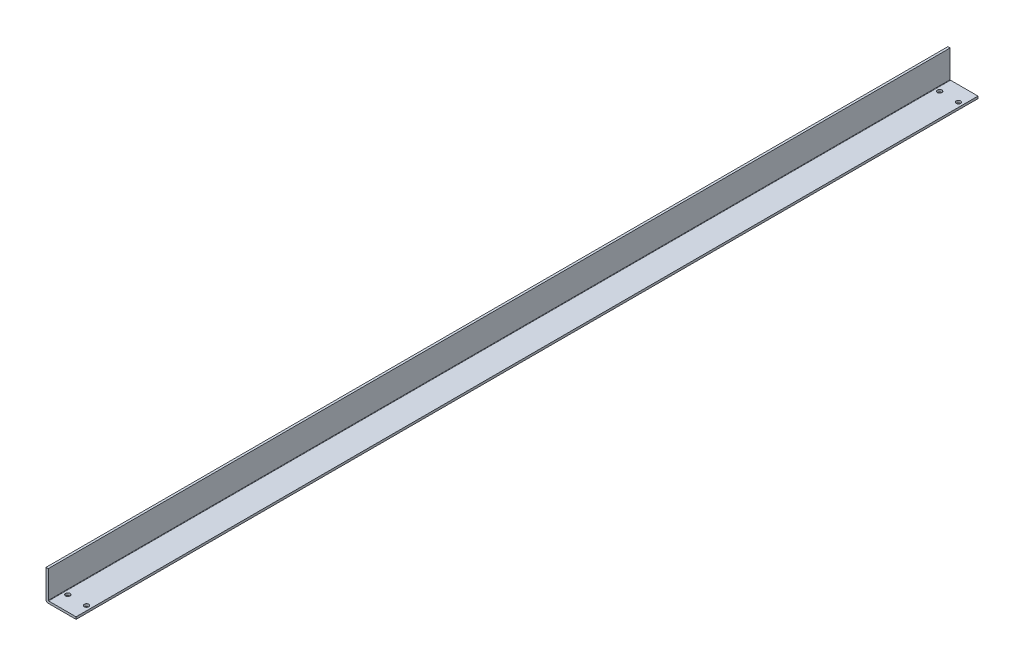
ISO-10303-21;
HEADER;
FILE_DESCRIPTION(('STEP AP214'),'2;1');
FILE_NAME('part.step','',(''),(''),'','','');
FILE_SCHEMA(('AUTOMOTIVE_DESIGN { 1 0 10303 214 1 1 1 1 }'));
ENDSEC;
DATA;
#1=APPLICATION_CONTEXT('core data for automotive mechanical design processes');
#2=APPLICATION_PROTOCOL_DEFINITION('international standard','automotive_design',2000,#1);
#3=PRODUCT_CONTEXT('',#1,'mechanical');
#4=PRODUCT('Part','Part','',(#3));
#5=PRODUCT_RELATED_PRODUCT_CATEGORY('part','',(#4));
#6=PRODUCT_DEFINITION_FORMATION('','',#4);
#7=PRODUCT_DEFINITION_CONTEXT('part definition',#1,'design');
#8=PRODUCT_DEFINITION('design','',#6,#7);
#9=PRODUCT_DEFINITION_SHAPE('','',#8);
#10=(LENGTH_UNIT() NAMED_UNIT(*) SI_UNIT(.MILLI.,.METRE.));
#11=(NAMED_UNIT(*) PLANE_ANGLE_UNIT() SI_UNIT($,.RADIAN.));
#12=(NAMED_UNIT(*) SI_UNIT($,.STERADIAN.) SOLID_ANGLE_UNIT());
#13=UNCERTAINTY_MEASURE_WITH_UNIT(LENGTH_MEASURE(1.E-05),#10,'distance_accuracy_value','');
#14=(GEOMETRIC_REPRESENTATION_CONTEXT(3) GLOBAL_UNCERTAINTY_ASSIGNED_CONTEXT((#13)) GLOBAL_UNIT_ASSIGNED_CONTEXT((#10,
#11,#12)) REPRESENTATION_CONTEXT('',''));
#15=CARTESIAN_POINT('',(0.,0.,0.));
#16=DIRECTION('',(0.,0.,1.));
#17=DIRECTION('',(1.,0.,0.));
#18=AXIS2_PLACEMENT_3D('',#15,#16,#17);
#19=CARTESIAN_POINT('',(0.,40.,1200.));
#20=DIRECTION('',(0.,-1.,0.));
#21=DIRECTION('',(0.,0.,-1.));
#22=AXIS2_PLACEMENT_3D('',#19,#20,#21);
#23=PLANE('',#22);
#24=DIRECTION('',(-1.,0.,0.));
#25=VECTOR('',#24,1.);
#26=CARTESIAN_POINT('',(0.,40.,0.));
#27=LINE('',#26,#25);
#28=CARTESIAN_POINT('',(3.,40.,0.));
#29=VERTEX_POINT('',#28);
#30=CARTESIAN_POINT('',(0.,40.,0.));
#31=VERTEX_POINT('',#30);
#32=EDGE_CURVE('E130',#29,#31,#27,.T.);
#33=ORIENTED_EDGE('',*,*,#32,.T.);
#34=DIRECTION('',(0.,0.,-1.));
#35=VECTOR('',#34,1.);
#36=CARTESIAN_POINT('',(0.,40.,1200.));
#37=LINE('',#36,#35);
#38=CARTESIAN_POINT('',(0.,40.,1200.));
#39=VERTEX_POINT('',#38);
#40=EDGE_CURVE('E11',#39,#31,#37,.T.);
#41=ORIENTED_EDGE('',*,*,#40,.F.);
#42=DIRECTION('',(-1.,0.,0.));
#43=VECTOR('',#42,1.);
#44=CARTESIAN_POINT('',(0.,40.,1200.));
#45=LINE('',#44,#43);
#46=CARTESIAN_POINT('',(3.,40.,1200.));
#47=VERTEX_POINT('',#46);
#48=EDGE_CURVE('E145',#47,#39,#45,.T.);
#49=ORIENTED_EDGE('',*,*,#48,.F.);
#50=DIRECTION('',(0.,0.,-1.));
#51=VECTOR('',#50,1.);
#52=CARTESIAN_POINT('',(3.,40.,1200.));
#53=LINE('',#52,#51);
#54=EDGE_CURVE('E126',#47,#29,#53,.T.);
#55=ORIENTED_EDGE('',*,*,#54,.T.);
#56=EDGE_LOOP('',(#33,#41,#49,#55));
#57=FACE_BOUND('',#56,.T.);
#58=ADVANCED_FACE('F34',(#57),#23,.F.);
#59=CARTESIAN_POINT('',(0.,3.00000000000002,1200.));
#60=DIRECTION('',(1.,0.,0.));
#61=DIRECTION('',(0.,0.,-1.));
#62=AXIS2_PLACEMENT_3D('',#59,#60,#61);
#63=PLANE('',#62);
#64=DIRECTION('',(0.,-1.,0.));
#65=VECTOR('',#64,1.);
#66=CARTESIAN_POINT('',(0.,3.00000000000002,0.));
#67=LINE('',#66,#65);
#68=CARTESIAN_POINT('',(0.,3.00000000000002,0.));
#69=VERTEX_POINT('',#68);
#70=EDGE_CURVE('E133',#31,#69,#67,.T.);
#71=ORIENTED_EDGE('',*,*,#70,.T.);
#72=DIRECTION('',(0.,0.,-1.));
#73=VECTOR('',#72,1.);
#74=CARTESIAN_POINT('',(0.,3.00000000000002,1200.));
#75=LINE('',#74,#73);
#76=CARTESIAN_POINT('',(0.,3.00000000000002,1200.));
#77=VERTEX_POINT('',#76);
#78=EDGE_CURVE('E42',#77,#69,#75,.T.);
#79=ORIENTED_EDGE('',*,*,#78,.F.);
#80=DIRECTION('',(0.,-1.,0.));
#81=VECTOR('',#80,1.);
#82=CARTESIAN_POINT('',(0.,3.00000000000002,1200.));
#83=LINE('',#82,#81);
#84=EDGE_CURVE('E93',#39,#77,#83,.T.);
#85=ORIENTED_EDGE('',*,*,#84,.F.);
#86=ORIENTED_EDGE('',*,*,#40,.T.);
#87=EDGE_LOOP('',(#71,#79,#85,#86));
#88=FACE_BOUND('',#87,.T.);
#89=ADVANCED_FACE('F229',(#88),#63,.F.);
#90=CARTESIAN_POINT('',(3.,3.,1200.));
#91=DIRECTION('',(0.,0.,-1.));
#92=DIRECTION('',(-1.,0.,0.));
#93=AXIS2_PLACEMENT_3D('',#90,#91,#92);
#94=CYLINDRICAL_SURFACE('',#93,3.);
#95=CARTESIAN_POINT('',(3.,3.,0.));
#96=DIRECTION('',(0.,0.,1.));
#97=DIRECTION('',(1.,0.,0.));
#98=AXIS2_PLACEMENT_3D('',#95,#96,#97);
#99=CIRCLE('',#98,3.);
#100=CARTESIAN_POINT('',(3.00000000000002,0.,0.));
#101=VERTEX_POINT('',#100);
#102=EDGE_CURVE('E136',#69,#101,#99,.T.);
#103=ORIENTED_EDGE('',*,*,#102,.T.);
#104=DIRECTION('',(0.,0.,-1.));
#105=VECTOR('',#104,1.);
#106=CARTESIAN_POINT('',(3.00000000000002,0.,1200.));
#107=LINE('',#106,#105);
#108=CARTESIAN_POINT('',(3.00000000000002,0.,1200.));
#109=VERTEX_POINT('',#108);
#110=EDGE_CURVE('E152',#109,#101,#107,.T.);
#111=ORIENTED_EDGE('',*,*,#110,.F.);
#112=CARTESIAN_POINT('',(3.,3.,1200.));
#113=DIRECTION('',(0.,0.,1.));
#114=DIRECTION('',(1.,0.,0.));
#115=AXIS2_PLACEMENT_3D('',#112,#113,#114);
#116=CIRCLE('',#115,3.);
#117=EDGE_CURVE('E160',#77,#109,#116,.T.);
#118=ORIENTED_EDGE('',*,*,#117,.F.);
#119=ORIENTED_EDGE('',*,*,#78,.T.);
#120=EDGE_LOOP('',(#103,#111,#118,#119));
#121=FACE_BOUND('',#120,.T.);
#122=ADVANCED_FACE('F158',(#121),#94,.T.);
#123=CARTESIAN_POINT('',(40.,0.,1200.));
#124=DIRECTION('',(0.,1.,0.));
#125=DIRECTION('',(0.,0.,1.));
#126=AXIS2_PLACEMENT_3D('',#123,#124,#125);
#127=PLANE('',#126);
#128=CARTESIAN_POINT('',(34.,0.,1180.));
#129=DIRECTION('',(0.,1.,0.));
#130=DIRECTION('',(0.,0.,1.));
#131=AXIS2_PLACEMENT_3D('',#128,#129,#130);
#132=CIRCLE('',#131,3.);
#133=CARTESIAN_POINT('',(34.,0.,1183.));
#134=VERTEX_POINT('',#133);
#135=EDGE_CURVE('E183',#134,#134,#132,.F.);
#136=ORIENTED_EDGE('',*,*,#135,.F.);
#137=EDGE_LOOP('',(#136));
#138=FACE_BOUND('',#137,.T.);
#139=CARTESIAN_POINT('',(9.,0.,20.));
#140=DIRECTION('',(0.,1.,0.));
#141=DIRECTION('',(0.,0.,1.));
#142=AXIS2_PLACEMENT_3D('',#139,#140,#141);
#143=CIRCLE('',#142,3.);
#144=CARTESIAN_POINT('',(9.,0.,23.));
#145=VERTEX_POINT('',#144);
#146=EDGE_CURVE('E191',#145,#145,#143,.F.);
#147=ORIENTED_EDGE('',*,*,#146,.F.);
#148=EDGE_LOOP('',(#147));
#149=FACE_BOUND('',#148,.T.);
#150=CARTESIAN_POINT('',(34.,0.,20.));
#151=DIRECTION('',(0.,1.,0.));
#152=DIRECTION('',(0.,0.,1.));
#153=AXIS2_PLACEMENT_3D('',#150,#151,#152);
#154=CIRCLE('',#153,3.);
#155=CARTESIAN_POINT('',(34.,0.,23.));
#156=VERTEX_POINT('',#155);
#157=EDGE_CURVE('E184',#156,#156,#154,.F.);
#158=ORIENTED_EDGE('',*,*,#157,.F.);
#159=EDGE_LOOP('',(#158));
#160=FACE_BOUND('',#159,.T.);
#161=CARTESIAN_POINT('',(9.,0.,1180.));
#162=DIRECTION('',(0.,1.,0.));
#163=DIRECTION('',(0.,0.,1.));
#164=AXIS2_PLACEMENT_3D('',#161,#162,#163);
#165=CIRCLE('',#164,3.);
#166=CARTESIAN_POINT('',(9.,0.,1183.));
#167=VERTEX_POINT('',#166);
#168=EDGE_CURVE('E134',#167,#167,#165,.F.);
#169=ORIENTED_EDGE('',*,*,#168,.F.);
#170=EDGE_LOOP('',(#169));
#171=FACE_BOUND('',#170,.T.);
#172=DIRECTION('',(1.,0.,0.));
#173=VECTOR('',#172,1.);
#174=CARTESIAN_POINT('',(40.,0.,0.));
#175=LINE('',#174,#173);
#176=CARTESIAN_POINT('',(40.,0.,0.));
#177=VERTEX_POINT('',#176);
#178=EDGE_CURVE('E138',#101,#177,#175,.T.);
#179=ORIENTED_EDGE('',*,*,#178,.T.);
#180=DIRECTION('',(0.,0.,-1.));
#181=VECTOR('',#180,1.);
#182=CARTESIAN_POINT('',(40.,0.,1200.));
#183=LINE('',#182,#181);
#184=CARTESIAN_POINT('',(40.,0.,1200.));
#185=VERTEX_POINT('',#184);
#186=EDGE_CURVE('E149',#185,#177,#183,.T.);
#187=ORIENTED_EDGE('',*,*,#186,.F.);
#188=DIRECTION('',(1.,0.,0.));
#189=VECTOR('',#188,1.);
#190=CARTESIAN_POINT('',(40.,0.,1200.));
#191=LINE('',#190,#189);
#192=EDGE_CURVE('E172',#109,#185,#191,.T.);
#193=ORIENTED_EDGE('',*,*,#192,.F.);
#194=ORIENTED_EDGE('',*,*,#110,.T.);
#195=EDGE_LOOP('',(#179,#187,#193,#194));
#196=FACE_BOUND('',#195,.T.);
#197=ADVANCED_FACE('F168',(#138,#149,#160,#171,#196),#127,.F.);
#198=CARTESIAN_POINT('',(40.,3.,1200.));
#199=DIRECTION('',(-1.,0.,0.));
#200=DIRECTION('',(0.,0.,1.));
#201=AXIS2_PLACEMENT_3D('',#198,#199,#200);
#202=PLANE('',#201);
#203=DIRECTION('',(0.,1.,0.));
#204=VECTOR('',#203,1.);
#205=CARTESIAN_POINT('',(40.,3.,0.));
#206=LINE('',#205,#204);
#207=CARTESIAN_POINT('',(40.,3.,0.));
#208=VERTEX_POINT('',#207);
#209=EDGE_CURVE('E140',#177,#208,#206,.T.);
#210=ORIENTED_EDGE('',*,*,#209,.T.);
#211=DIRECTION('',(0.,0.,-1.));
#212=VECTOR('',#211,1.);
#213=CARTESIAN_POINT('',(40.,3.,1200.));
#214=LINE('',#213,#212);
#215=CARTESIAN_POINT('',(40.,3.,1200.));
#216=VERTEX_POINT('',#215);
#217=EDGE_CURVE('E121',#216,#208,#214,.T.);
#218=ORIENTED_EDGE('',*,*,#217,.F.);
#219=DIRECTION('',(0.,1.,0.));
#220=VECTOR('',#219,1.);
#221=CARTESIAN_POINT('',(40.,3.,1200.));
#222=LINE('',#221,#220);
#223=EDGE_CURVE('E112',#185,#216,#222,.T.);
#224=ORIENTED_EDGE('',*,*,#223,.F.);
#225=ORIENTED_EDGE('',*,*,#186,.T.);
#226=EDGE_LOOP('',(#210,#218,#224,#225));
#227=FACE_BOUND('',#226,.T.);
#228=ADVANCED_FACE('F171',(#227),#202,.F.);
#229=CARTESIAN_POINT('',(3.50000000000001,3.,1200.));
#230=DIRECTION('',(0.,-1.,0.));
#231=DIRECTION('',(0.,0.,-1.));
#232=AXIS2_PLACEMENT_3D('',#229,#230,#231);
#233=PLANE('',#232);
#234=CARTESIAN_POINT('',(34.,3.,1180.));
#235=DIRECTION('',(0.,1.,0.));
#236=DIRECTION('',(0.,0.,1.));
#237=AXIS2_PLACEMENT_3D('',#234,#235,#236);
#238=CIRCLE('',#237,3.);
#239=CARTESIAN_POINT('',(34.,3.,1183.));
#240=VERTEX_POINT('',#239);
#241=EDGE_CURVE('E194',#240,#240,#238,.T.);
#242=ORIENTED_EDGE('',*,*,#241,.F.);
#243=EDGE_LOOP('',(#242));
#244=FACE_BOUND('',#243,.T.);
#245=CARTESIAN_POINT('',(9.,3.,20.));
#246=DIRECTION('',(0.,1.,0.));
#247=DIRECTION('',(0.,0.,1.));
#248=AXIS2_PLACEMENT_3D('',#245,#246,#247);
#249=CIRCLE('',#248,3.);
#250=CARTESIAN_POINT('',(9.,3.,23.));
#251=VERTEX_POINT('',#250);
#252=EDGE_CURVE('E187',#251,#251,#249,.T.);
#253=ORIENTED_EDGE('',*,*,#252,.F.);
#254=EDGE_LOOP('',(#253));
#255=FACE_BOUND('',#254,.T.);
#256=CARTESIAN_POINT('',(34.,3.,20.));
#257=DIRECTION('',(0.,1.,0.));
#258=DIRECTION('',(0.,0.,1.));
#259=AXIS2_PLACEMENT_3D('',#256,#257,#258);
#260=CIRCLE('',#259,3.);
#261=CARTESIAN_POINT('',(34.,3.,23.));
#262=VERTEX_POINT('',#261);
#263=EDGE_CURVE('E188',#262,#262,#260,.T.);
#264=ORIENTED_EDGE('',*,*,#263,.F.);
#265=EDGE_LOOP('',(#264));
#266=FACE_BOUND('',#265,.T.);
#267=CARTESIAN_POINT('',(9.,3.,1180.));
#268=DIRECTION('',(0.,1.,0.));
#269=DIRECTION('',(0.,0.,1.));
#270=AXIS2_PLACEMENT_3D('',#267,#268,#269);
#271=CIRCLE('',#270,3.);
#272=CARTESIAN_POINT('',(9.,3.,1183.));
#273=VERTEX_POINT('',#272);
#274=EDGE_CURVE('E180',#273,#273,#271,.T.);
#275=ORIENTED_EDGE('',*,*,#274,.F.);
#276=EDGE_LOOP('',(#275));
#277=FACE_BOUND('',#276,.T.);
#278=DIRECTION('',(-1.,0.,0.));
#279=VECTOR('',#278,1.);
#280=CARTESIAN_POINT('',(3.50000000000001,3.,0.));
#281=LINE('',#280,#279);
#282=CARTESIAN_POINT('',(3.50000000000001,3.,0.));
#283=VERTEX_POINT('',#282);
#284=EDGE_CURVE('E120',#208,#283,#281,.T.);
#285=ORIENTED_EDGE('',*,*,#284,.T.);
#286=DIRECTION('',(0.,0.,-1.));
#287=VECTOR('',#286,1.);
#288=CARTESIAN_POINT('',(3.50000000000001,3.,1200.));
#289=LINE('',#288,#287);
#290=CARTESIAN_POINT('',(3.50000000000001,3.,1200.));
#291=VERTEX_POINT('',#290);
#292=EDGE_CURVE('E117',#291,#283,#289,.T.);
#293=ORIENTED_EDGE('',*,*,#292,.F.);
#294=DIRECTION('',(-1.,0.,0.));
#295=VECTOR('',#294,1.);
#296=CARTESIAN_POINT('',(3.50000000000001,3.,1200.));
#297=LINE('',#296,#295);
#298=EDGE_CURVE('E106',#216,#291,#297,.T.);
#299=ORIENTED_EDGE('',*,*,#298,.F.);
#300=ORIENTED_EDGE('',*,*,#217,.T.);
#301=EDGE_LOOP('',(#285,#293,#299,#300));
#302=FACE_BOUND('',#301,.T.);
#303=ADVANCED_FACE('F118',(#244,#255,#266,#277,#302),#233,.F.);
#304=CARTESIAN_POINT('',(3.5,3.5,1200.));
#305=DIRECTION('',(0.,0.,-1.));
#306=DIRECTION('',(-1.,0.,0.));
#307=AXIS2_PLACEMENT_3D('',#304,#305,#306);
#308=CYLINDRICAL_SURFACE('',#307,0.5);
#309=CARTESIAN_POINT('',(3.5,3.5,0.));
#310=DIRECTION('',(0.,0.,-1.));
#311=DIRECTION('',(1.,0.,0.));
#312=AXIS2_PLACEMENT_3D('',#309,#310,#311);
#313=CIRCLE('',#312,0.5);
#314=CARTESIAN_POINT('',(3.,3.5,0.));
#315=VERTEX_POINT('',#314);
#316=EDGE_CURVE('E79',#283,#315,#313,.T.);
#317=ORIENTED_EDGE('',*,*,#316,.T.);
#318=DIRECTION('',(0.,0.,-1.));
#319=VECTOR('',#318,1.);
#320=CARTESIAN_POINT('',(3.,3.5,1200.));
#321=LINE('',#320,#319);
#322=CARTESIAN_POINT('',(3.,3.5,1200.));
#323=VERTEX_POINT('',#322);
#324=EDGE_CURVE('E122',#323,#315,#321,.T.);
#325=ORIENTED_EDGE('',*,*,#324,.F.);
#326=CARTESIAN_POINT('',(3.5,3.5,1200.));
#327=DIRECTION('',(0.,0.,-1.));
#328=DIRECTION('',(1.,0.,0.));
#329=AXIS2_PLACEMENT_3D('',#326,#327,#328);
#330=CIRCLE('',#329,0.5);
#331=EDGE_CURVE('E110',#291,#323,#330,.T.);
#332=ORIENTED_EDGE('',*,*,#331,.F.);
#333=ORIENTED_EDGE('',*,*,#292,.T.);
#334=EDGE_LOOP('',(#317,#325,#332,#333));
#335=FACE_BOUND('',#334,.T.);
#336=ADVANCED_FACE('F124',(#335),#308,.F.);
#337=CARTESIAN_POINT('',(3.,40.,1200.));
#338=DIRECTION('',(-1.,0.,0.));
#339=DIRECTION('',(0.,-1.,0.));
#340=AXIS2_PLACEMENT_3D('',#337,#338,#339);
#341=PLANE('',#340);
#342=DIRECTION('',(0.,1.,0.));
#343=VECTOR('',#342,1.);
#344=CARTESIAN_POINT('',(3.,40.,0.));
#345=LINE('',#344,#343);
#346=EDGE_CURVE('E85',#315,#29,#345,.T.);
#347=ORIENTED_EDGE('',*,*,#346,.T.);
#348=ORIENTED_EDGE('',*,*,#54,.F.);
#349=DIRECTION('',(0.,1.,0.));
#350=VECTOR('',#349,1.);
#351=CARTESIAN_POINT('',(3.,40.,1200.));
#352=LINE('',#351,#350);
#353=EDGE_CURVE('E50',#323,#47,#352,.T.);
#354=ORIENTED_EDGE('',*,*,#353,.F.);
#355=ORIENTED_EDGE('',*,*,#324,.T.);
#356=EDGE_LOOP('',(#347,#348,#354,#355));
#357=FACE_BOUND('',#356,.T.);
#358=ADVANCED_FACE('F240',(#357),#341,.F.);
#359=CARTESIAN_POINT('',(3.5,3.5,1200.));
#360=DIRECTION('',(0.,0.,1.));
#361=DIRECTION('',(1.,0.,0.));
#362=AXIS2_PLACEMENT_3D('',#359,#360,#361);
#363=PLANE('',#362);
#364=ORIENTED_EDGE('',*,*,#48,.T.);
#365=ORIENTED_EDGE('',*,*,#84,.T.);
#366=ORIENTED_EDGE('',*,*,#117,.T.);
#367=ORIENTED_EDGE('',*,*,#192,.T.);
#368=ORIENTED_EDGE('',*,*,#223,.T.);
#369=ORIENTED_EDGE('',*,*,#298,.T.);
#370=ORIENTED_EDGE('',*,*,#331,.T.);
#371=ORIENTED_EDGE('',*,*,#353,.T.);
#372=EDGE_LOOP('',(#364,#365,#366,#367,#368,#369,#370,#371));
#373=FACE_BOUND('',#372,.T.);
#374=ADVANCED_FACE('F108',(#373),#363,.T.);
#375=CARTESIAN_POINT('',(3.5,3.5,0.));
#376=DIRECTION('',(0.,0.,1.));
#377=DIRECTION('',(1.,0.,0.));
#378=AXIS2_PLACEMENT_3D('',#375,#376,#377);
#379=PLANE('',#378);
#380=ORIENTED_EDGE('',*,*,#32,.F.);
#381=ORIENTED_EDGE('',*,*,#346,.F.);
#382=ORIENTED_EDGE('',*,*,#316,.F.);
#383=ORIENTED_EDGE('',*,*,#284,.F.);
#384=ORIENTED_EDGE('',*,*,#209,.F.);
#385=ORIENTED_EDGE('',*,*,#178,.F.);
#386=ORIENTED_EDGE('',*,*,#102,.F.);
#387=ORIENTED_EDGE('',*,*,#70,.F.);
#388=EDGE_LOOP('',(#380,#381,#382,#383,#384,#385,#386,#387));
#389=FACE_BOUND('',#388,.T.);
#390=ADVANCED_FACE('F164',(#389),#379,.F.);
#391=CARTESIAN_POINT('',(9.,-0.00100000000000013,1180.));
#392=DIRECTION('',(0.,1.,0.));
#393=DIRECTION('',(0.,0.,1.));
#394=AXIS2_PLACEMENT_3D('',#391,#392,#393);
#395=CYLINDRICAL_SURFACE('',#394,3.);
#396=CARTESIAN_POINT('',(9.,3.,1183.));
#397=CARTESIAN_POINT('',(9.,2.96875,1183.));
#398=CARTESIAN_POINT('',(9.,2.9375,1183.));
#399=CARTESIAN_POINT('',(9.,2.875,1183.));
#400=CARTESIAN_POINT('',(9.,2.84375,1183.));
#401=CARTESIAN_POINT('',(9.,2.78125,1183.));
#402=CARTESIAN_POINT('',(9.,2.75,1183.));
#403=CARTESIAN_POINT('',(9.,2.6875,1183.));
#404=CARTESIAN_POINT('',(9.,2.65625,1183.));
#405=CARTESIAN_POINT('',(9.,2.59375,1183.));
#406=CARTESIAN_POINT('',(9.,2.5625,1183.));
#407=CARTESIAN_POINT('',(9.,2.5,1183.));
#408=CARTESIAN_POINT('',(9.,2.46875,1183.));
#409=CARTESIAN_POINT('',(9.,2.40625,1183.));
#410=CARTESIAN_POINT('',(9.,2.375,1183.));
#411=CARTESIAN_POINT('',(9.,2.3125,1183.));
#412=CARTESIAN_POINT('',(9.,2.28125,1183.));
#413=CARTESIAN_POINT('',(9.,2.21875,1183.));
#414=CARTESIAN_POINT('',(9.,2.1875,1183.));
#415=CARTESIAN_POINT('',(9.,2.125,1183.));
#416=CARTESIAN_POINT('',(9.,2.09375,1183.));
#417=CARTESIAN_POINT('',(9.,2.03125,1183.));
#418=CARTESIAN_POINT('',(9.,2.,1183.));
#419=CARTESIAN_POINT('',(9.,1.9375,1183.));
#420=CARTESIAN_POINT('',(9.,1.90625,1183.));
#421=CARTESIAN_POINT('',(9.,1.84375,1183.));
#422=CARTESIAN_POINT('',(9.,1.8125,1183.));
#423=CARTESIAN_POINT('',(9.,1.75,1183.));
#424=CARTESIAN_POINT('',(9.,1.71875,1183.));
#425=CARTESIAN_POINT('',(9.,1.65625,1183.));
#426=CARTESIAN_POINT('',(9.,1.625,1183.));
#427=CARTESIAN_POINT('',(9.,1.5625,1183.));
#428=CARTESIAN_POINT('',(9.,1.53125,1183.));
#429=CARTESIAN_POINT('',(9.,1.46875,1183.));
#430=CARTESIAN_POINT('',(9.,1.4375,1183.));
#431=CARTESIAN_POINT('',(9.,1.375,1183.));
#432=CARTESIAN_POINT('',(9.,1.34375,1183.));
#433=CARTESIAN_POINT('',(9.,1.28125,1183.));
#434=CARTESIAN_POINT('',(9.,1.25,1183.));
#435=CARTESIAN_POINT('',(9.,1.1875,1183.));
#436=CARTESIAN_POINT('',(9.,1.15625,1183.));
#437=CARTESIAN_POINT('',(9.,1.09375,1183.));
#438=CARTESIAN_POINT('',(9.,1.0625,1183.));
#439=CARTESIAN_POINT('',(9.,1.,1183.));
#440=CARTESIAN_POINT('',(9.,0.96875,1183.));
#441=CARTESIAN_POINT('',(9.,0.90625,1183.));
#442=CARTESIAN_POINT('',(9.,0.875,1183.));
#443=CARTESIAN_POINT('',(9.,0.8125,1183.));
#444=CARTESIAN_POINT('',(9.,0.78125,1183.));
#445=CARTESIAN_POINT('',(9.,0.71875,1183.));
#446=CARTESIAN_POINT('',(9.,0.6875,1183.));
#447=CARTESIAN_POINT('',(9.,0.625,1183.));
#448=CARTESIAN_POINT('',(9.,0.59375,1183.));
#449=CARTESIAN_POINT('',(9.,0.53125,1183.));
#450=CARTESIAN_POINT('',(9.,0.5,1183.));
#451=CARTESIAN_POINT('',(9.,0.4375,1183.));
#452=CARTESIAN_POINT('',(9.,0.40625,1183.));
#453=CARTESIAN_POINT('',(9.,0.34375,1183.));
#454=CARTESIAN_POINT('',(9.,0.3125,1183.));
#455=CARTESIAN_POINT('',(9.,0.25,1183.));
#456=CARTESIAN_POINT('',(9.,0.21875,1183.));
#457=CARTESIAN_POINT('',(9.,0.15625,1183.));
#458=CARTESIAN_POINT('',(9.,0.125,1183.));
#459=CARTESIAN_POINT('',(9.,0.0625000000000001,1183.));
#460=CARTESIAN_POINT('',(9.,0.0312500000000001,1183.));
#461=CARTESIAN_POINT('',(9.,0.,1183.));
#462=B_SPLINE_CURVE_WITH_KNOTS('',3,(#396,#397,#398,#399,#400,#401,#402,#403,#404,#405,#406,
#407,#408,#409,#410,#411,#412,#413,#414,#415,#416,#417,#418,#419,#420,#421,#422,#423,#424,#425,
#426,#427,#428,#429,#430,#431,#432,#433,#434,#435,#436,#437,#438,#439,#440,#441,#442,#443,#444,
#445,#446,#447,#448,#449,#450,#451,#452,#453,#454,#455,#456,#457,#458,#459,#460,#461),
.UNSPECIFIED.,.F.,.F.,(4,2,2,2,2,2,2,2,2,2,2,2,2,2,2,2,2,2,2,2,2,2,2,2,2,2,2,2,2,2,2,2,4),(0.,
0.0937500000000001,0.1875,0.28125,0.375,0.46875,0.5625,0.65625,0.75,0.84375,0.9375,1.03125,
1.125,1.21875,1.3125,1.40625,1.5,1.59375,1.6875,1.78125,1.875,1.96875,2.0625,2.15625,2.25,
2.34375,2.4375,2.53125,2.625,2.71875,2.8125,2.90625,3.),.UNSPECIFIED.);
#463=EDGE_CURVE('BSEAM214',#273,#167,#462,.T.);
#464=ORIENTED_EDGE('',*,*,#274,.T.);
#465=ORIENTED_EDGE('',*,*,#168,.T.);
#466=ORIENTED_EDGE('',*,*,#463,.T.);
#467=ORIENTED_EDGE('',*,*,#463,.F.);
#468=EDGE_LOOP('',(#464,#466,#465,#467));
#469=FACE_BOUND('',#468,.T.);
#470=ADVANCED_FACE('F214',(#469),#395,.F.);
#471=CARTESIAN_POINT('',(34.,-0.00100000000000013,20.));
#472=DIRECTION('',(0.,1.,0.));
#473=DIRECTION('',(0.,0.,1.));
#474=AXIS2_PLACEMENT_3D('',#471,#472,#473);
#475=CYLINDRICAL_SURFACE('',#474,3.);
#476=CARTESIAN_POINT('',(34.,3.,23.));
#477=CARTESIAN_POINT('',(34.,2.96875,23.));
#478=CARTESIAN_POINT('',(34.,2.9375,23.));
#479=CARTESIAN_POINT('',(34.,2.875,23.));
#480=CARTESIAN_POINT('',(34.,2.84375,23.));
#481=CARTESIAN_POINT('',(34.,2.78125,23.));
#482=CARTESIAN_POINT('',(34.,2.75,23.));
#483=CARTESIAN_POINT('',(34.,2.6875,23.));
#484=CARTESIAN_POINT('',(34.,2.65625,23.));
#485=CARTESIAN_POINT('',(34.,2.59375,23.));
#486=CARTESIAN_POINT('',(34.,2.5625,23.));
#487=CARTESIAN_POINT('',(34.,2.5,23.));
#488=CARTESIAN_POINT('',(34.,2.46875,23.));
#489=CARTESIAN_POINT('',(34.,2.40625,23.));
#490=CARTESIAN_POINT('',(34.,2.375,23.));
#491=CARTESIAN_POINT('',(34.,2.3125,23.));
#492=CARTESIAN_POINT('',(34.,2.28125,23.));
#493=CARTESIAN_POINT('',(34.,2.21875,23.));
#494=CARTESIAN_POINT('',(34.,2.1875,23.));
#495=CARTESIAN_POINT('',(34.,2.125,23.));
#496=CARTESIAN_POINT('',(34.,2.09375,23.));
#497=CARTESIAN_POINT('',(34.,2.03125,23.));
#498=CARTESIAN_POINT('',(34.,2.,23.));
#499=CARTESIAN_POINT('',(34.,1.9375,23.));
#500=CARTESIAN_POINT('',(34.,1.90625,23.));
#501=CARTESIAN_POINT('',(34.,1.84375,23.));
#502=CARTESIAN_POINT('',(34.,1.8125,23.));
#503=CARTESIAN_POINT('',(34.,1.75,23.));
#504=CARTESIAN_POINT('',(34.,1.71875,23.));
#505=CARTESIAN_POINT('',(34.,1.65625,23.));
#506=CARTESIAN_POINT('',(34.,1.625,23.));
#507=CARTESIAN_POINT('',(34.,1.5625,23.));
#508=CARTESIAN_POINT('',(34.,1.53125,23.));
#509=CARTESIAN_POINT('',(34.,1.46875,23.));
#510=CARTESIAN_POINT('',(34.,1.4375,23.));
#511=CARTESIAN_POINT('',(34.,1.375,23.));
#512=CARTESIAN_POINT('',(34.,1.34375,23.));
#513=CARTESIAN_POINT('',(34.,1.28125,23.));
#514=CARTESIAN_POINT('',(34.,1.25,23.));
#515=CARTESIAN_POINT('',(34.,1.1875,23.));
#516=CARTESIAN_POINT('',(34.,1.15625,23.));
#517=CARTESIAN_POINT('',(34.,1.09375,23.));
#518=CARTESIAN_POINT('',(34.,1.0625,23.));
#519=CARTESIAN_POINT('',(34.,1.,23.));
#520=CARTESIAN_POINT('',(34.,0.96875,23.));
#521=CARTESIAN_POINT('',(34.,0.90625,23.));
#522=CARTESIAN_POINT('',(34.,0.875,23.));
#523=CARTESIAN_POINT('',(34.,0.8125,23.));
#524=CARTESIAN_POINT('',(34.,0.78125,23.));
#525=CARTESIAN_POINT('',(34.,0.71875,23.));
#526=CARTESIAN_POINT('',(34.,0.6875,23.));
#527=CARTESIAN_POINT('',(34.,0.625,23.));
#528=CARTESIAN_POINT('',(34.,0.59375,23.));
#529=CARTESIAN_POINT('',(34.,0.53125,23.));
#530=CARTESIAN_POINT('',(34.,0.5,23.));
#531=CARTESIAN_POINT('',(34.,0.4375,23.));
#532=CARTESIAN_POINT('',(34.,0.40625,23.));
#533=CARTESIAN_POINT('',(34.,0.34375,23.));
#534=CARTESIAN_POINT('',(34.,0.3125,23.));
#535=CARTESIAN_POINT('',(34.,0.25,23.));
#536=CARTESIAN_POINT('',(34.,0.21875,23.));
#537=CARTESIAN_POINT('',(34.,0.15625,23.));
#538=CARTESIAN_POINT('',(34.,0.125,23.));
#539=CARTESIAN_POINT('',(34.,0.0625000000000001,23.));
#540=CARTESIAN_POINT('',(34.,0.0312500000000001,23.));
#541=CARTESIAN_POINT('',(34.,0.,23.));
#542=B_SPLINE_CURVE_WITH_KNOTS('',3,(#476,#477,#478,#479,#480,#481,#482,#483,#484,#485,#486,
#487,#488,#489,#490,#491,#492,#493,#494,#495,#496,#497,#498,#499,#500,#501,#502,#503,#504,#505,
#506,#507,#508,#509,#510,#511,#512,#513,#514,#515,#516,#517,#518,#519,#520,#521,#522,#523,#524,
#525,#526,#527,#528,#529,#530,#531,#532,#533,#534,#535,#536,#537,#538,#539,#540,#541),
.UNSPECIFIED.,.F.,.F.,(4,2,2,2,2,2,2,2,2,2,2,2,2,2,2,2,2,2,2,2,2,2,2,2,2,2,2,2,2,2,2,2,4),(0.,
0.0937500000000001,0.1875,0.28125,0.375,0.46875,0.5625,0.65625,0.75,0.84375,0.9375,1.03125,
1.125,1.21875,1.3125,1.40625,1.5,1.59375,1.6875,1.78125,1.875,1.96875,2.0625,2.15625,2.25,
2.34375,2.4375,2.53125,2.625,2.71875,2.8125,2.90625,3.),.UNSPECIFIED.);
#543=EDGE_CURVE('BSEAM217',#262,#156,#542,.T.);
#544=ORIENTED_EDGE('',*,*,#263,.T.);
#545=ORIENTED_EDGE('',*,*,#157,.T.);
#546=ORIENTED_EDGE('',*,*,#543,.T.);
#547=ORIENTED_EDGE('',*,*,#543,.F.);
#548=EDGE_LOOP('',(#544,#546,#545,#547));
#549=FACE_BOUND('',#548,.T.);
#550=ADVANCED_FACE('F217',(#549),#475,.F.);
#551=CARTESIAN_POINT('',(9.,-0.00100000000000013,20.));
#552=DIRECTION('',(0.,1.,0.));
#553=DIRECTION('',(0.,0.,1.));
#554=AXIS2_PLACEMENT_3D('',#551,#552,#553);
#555=CYLINDRICAL_SURFACE('',#554,3.);
#556=CARTESIAN_POINT('',(9.,3.,23.));
#557=CARTESIAN_POINT('',(9.,2.96875,23.));
#558=CARTESIAN_POINT('',(9.,2.9375,23.));
#559=CARTESIAN_POINT('',(9.,2.875,23.));
#560=CARTESIAN_POINT('',(9.,2.84375,23.));
#561=CARTESIAN_POINT('',(9.,2.78125,23.));
#562=CARTESIAN_POINT('',(9.,2.75,23.));
#563=CARTESIAN_POINT('',(9.,2.6875,23.));
#564=CARTESIAN_POINT('',(9.,2.65625,23.));
#565=CARTESIAN_POINT('',(9.,2.59375,23.));
#566=CARTESIAN_POINT('',(9.,2.5625,23.));
#567=CARTESIAN_POINT('',(9.,2.5,23.));
#568=CARTESIAN_POINT('',(9.,2.46875,23.));
#569=CARTESIAN_POINT('',(9.,2.40625,23.));
#570=CARTESIAN_POINT('',(9.,2.375,23.));
#571=CARTESIAN_POINT('',(9.,2.3125,23.));
#572=CARTESIAN_POINT('',(9.,2.28125,23.));
#573=CARTESIAN_POINT('',(9.,2.21875,23.));
#574=CARTESIAN_POINT('',(9.,2.1875,23.));
#575=CARTESIAN_POINT('',(9.,2.125,23.));
#576=CARTESIAN_POINT('',(9.,2.09375,23.));
#577=CARTESIAN_POINT('',(9.,2.03125,23.));
#578=CARTESIAN_POINT('',(9.,2.,23.));
#579=CARTESIAN_POINT('',(9.,1.9375,23.));
#580=CARTESIAN_POINT('',(9.,1.90625,23.));
#581=CARTESIAN_POINT('',(9.,1.84375,23.));
#582=CARTESIAN_POINT('',(9.,1.8125,23.));
#583=CARTESIAN_POINT('',(9.,1.75,23.));
#584=CARTESIAN_POINT('',(9.,1.71875,23.));
#585=CARTESIAN_POINT('',(9.,1.65625,23.));
#586=CARTESIAN_POINT('',(9.,1.625,23.));
#587=CARTESIAN_POINT('',(9.,1.5625,23.));
#588=CARTESIAN_POINT('',(9.,1.53125,23.));
#589=CARTESIAN_POINT('',(9.,1.46875,23.));
#590=CARTESIAN_POINT('',(9.,1.4375,23.));
#591=CARTESIAN_POINT('',(9.,1.375,23.));
#592=CARTESIAN_POINT('',(9.,1.34375,23.));
#593=CARTESIAN_POINT('',(9.,1.28125,23.));
#594=CARTESIAN_POINT('',(9.,1.25,23.));
#595=CARTESIAN_POINT('',(9.,1.1875,23.));
#596=CARTESIAN_POINT('',(9.,1.15625,23.));
#597=CARTESIAN_POINT('',(9.,1.09375,23.));
#598=CARTESIAN_POINT('',(9.,1.0625,23.));
#599=CARTESIAN_POINT('',(9.,1.,23.));
#600=CARTESIAN_POINT('',(9.,0.96875,23.));
#601=CARTESIAN_POINT('',(9.,0.90625,23.));
#602=CARTESIAN_POINT('',(9.,0.875,23.));
#603=CARTESIAN_POINT('',(9.,0.8125,23.));
#604=CARTESIAN_POINT('',(9.,0.78125,23.));
#605=CARTESIAN_POINT('',(9.,0.71875,23.));
#606=CARTESIAN_POINT('',(9.,0.6875,23.));
#607=CARTESIAN_POINT('',(9.,0.625,23.));
#608=CARTESIAN_POINT('',(9.,0.59375,23.));
#609=CARTESIAN_POINT('',(9.,0.53125,23.));
#610=CARTESIAN_POINT('',(9.,0.5,23.));
#611=CARTESIAN_POINT('',(9.,0.4375,23.));
#612=CARTESIAN_POINT('',(9.,0.40625,23.));
#613=CARTESIAN_POINT('',(9.,0.34375,23.));
#614=CARTESIAN_POINT('',(9.,0.3125,23.));
#615=CARTESIAN_POINT('',(9.,0.25,23.));
#616=CARTESIAN_POINT('',(9.,0.21875,23.));
#617=CARTESIAN_POINT('',(9.,0.15625,23.));
#618=CARTESIAN_POINT('',(9.,0.125,23.));
#619=CARTESIAN_POINT('',(9.,0.0625000000000001,23.));
#620=CARTESIAN_POINT('',(9.,0.0312500000000001,23.));
#621=CARTESIAN_POINT('',(9.,0.,23.));
#622=B_SPLINE_CURVE_WITH_KNOTS('',3,(#556,#557,#558,#559,#560,#561,#562,#563,#564,#565,#566,
#567,#568,#569,#570,#571,#572,#573,#574,#575,#576,#577,#578,#579,#580,#581,#582,#583,#584,#585,
#586,#587,#588,#589,#590,#591,#592,#593,#594,#595,#596,#597,#598,#599,#600,#601,#602,#603,#604,
#605,#606,#607,#608,#609,#610,#611,#612,#613,#614,#615,#616,#617,#618,#619,#620,#621),
.UNSPECIFIED.,.F.,.F.,(4,2,2,2,2,2,2,2,2,2,2,2,2,2,2,2,2,2,2,2,2,2,2,2,2,2,2,2,2,2,2,2,4),(0.,
0.0937500000000001,0.1875,0.28125,0.375,0.46875,0.5625,0.65625,0.75,0.84375,0.9375,1.03125,
1.125,1.21875,1.3125,1.40625,1.5,1.59375,1.6875,1.78125,1.875,1.96875,2.0625,2.15625,2.25,
2.34375,2.4375,2.53125,2.625,2.71875,2.8125,2.90625,3.),.UNSPECIFIED.);
#623=EDGE_CURVE('BSEAM254',#251,#145,#622,.T.);
#624=ORIENTED_EDGE('',*,*,#252,.T.);
#625=ORIENTED_EDGE('',*,*,#146,.T.);
#626=ORIENTED_EDGE('',*,*,#623,.T.);
#627=ORIENTED_EDGE('',*,*,#623,.F.);
#628=EDGE_LOOP('',(#624,#626,#625,#627));
#629=FACE_BOUND('',#628,.T.);
#630=ADVANCED_FACE('F254',(#629),#555,.F.);
#631=CARTESIAN_POINT('',(34.,-0.00100000000000013,1180.));
#632=DIRECTION('',(0.,1.,0.));
#633=DIRECTION('',(0.,0.,1.));
#634=AXIS2_PLACEMENT_3D('',#631,#632,#633);
#635=CYLINDRICAL_SURFACE('',#634,3.);
#636=CARTESIAN_POINT('',(34.,3.,1183.));
#637=CARTESIAN_POINT('',(34.,2.96875,1183.));
#638=CARTESIAN_POINT('',(34.,2.9375,1183.));
#639=CARTESIAN_POINT('',(34.,2.875,1183.));
#640=CARTESIAN_POINT('',(34.,2.84375,1183.));
#641=CARTESIAN_POINT('',(34.,2.78125,1183.));
#642=CARTESIAN_POINT('',(34.,2.75,1183.));
#643=CARTESIAN_POINT('',(34.,2.6875,1183.));
#644=CARTESIAN_POINT('',(34.,2.65625,1183.));
#645=CARTESIAN_POINT('',(34.,2.59375,1183.));
#646=CARTESIAN_POINT('',(34.,2.5625,1183.));
#647=CARTESIAN_POINT('',(34.,2.5,1183.));
#648=CARTESIAN_POINT('',(34.,2.46875,1183.));
#649=CARTESIAN_POINT('',(34.,2.40625,1183.));
#650=CARTESIAN_POINT('',(34.,2.375,1183.));
#651=CARTESIAN_POINT('',(34.,2.3125,1183.));
#652=CARTESIAN_POINT('',(34.,2.28125,1183.));
#653=CARTESIAN_POINT('',(34.,2.21875,1183.));
#654=CARTESIAN_POINT('',(34.,2.1875,1183.));
#655=CARTESIAN_POINT('',(34.,2.125,1183.));
#656=CARTESIAN_POINT('',(34.,2.09375,1183.));
#657=CARTESIAN_POINT('',(34.,2.03125,1183.));
#658=CARTESIAN_POINT('',(34.,2.,1183.));
#659=CARTESIAN_POINT('',(34.,1.9375,1183.));
#660=CARTESIAN_POINT('',(34.,1.90625,1183.));
#661=CARTESIAN_POINT('',(34.,1.84375,1183.));
#662=CARTESIAN_POINT('',(34.,1.8125,1183.));
#663=CARTESIAN_POINT('',(34.,1.75,1183.));
#664=CARTESIAN_POINT('',(34.,1.71875,1183.));
#665=CARTESIAN_POINT('',(34.,1.65625,1183.));
#666=CARTESIAN_POINT('',(34.,1.625,1183.));
#667=CARTESIAN_POINT('',(34.,1.5625,1183.));
#668=CARTESIAN_POINT('',(34.,1.53125,1183.));
#669=CARTESIAN_POINT('',(34.,1.46875,1183.));
#670=CARTESIAN_POINT('',(34.,1.4375,1183.));
#671=CARTESIAN_POINT('',(34.,1.375,1183.));
#672=CARTESIAN_POINT('',(34.,1.34375,1183.));
#673=CARTESIAN_POINT('',(34.,1.28125,1183.));
#674=CARTESIAN_POINT('',(34.,1.25,1183.));
#675=CARTESIAN_POINT('',(34.,1.1875,1183.));
#676=CARTESIAN_POINT('',(34.,1.15625,1183.));
#677=CARTESIAN_POINT('',(34.,1.09375,1183.));
#678=CARTESIAN_POINT('',(34.,1.0625,1183.));
#679=CARTESIAN_POINT('',(34.,1.,1183.));
#680=CARTESIAN_POINT('',(34.,0.96875,1183.));
#681=CARTESIAN_POINT('',(34.,0.90625,1183.));
#682=CARTESIAN_POINT('',(34.,0.875,1183.));
#683=CARTESIAN_POINT('',(34.,0.8125,1183.));
#684=CARTESIAN_POINT('',(34.,0.78125,1183.));
#685=CARTESIAN_POINT('',(34.,0.71875,1183.));
#686=CARTESIAN_POINT('',(34.,0.6875,1183.));
#687=CARTESIAN_POINT('',(34.,0.625,1183.));
#688=CARTESIAN_POINT('',(34.,0.59375,1183.));
#689=CARTESIAN_POINT('',(34.,0.53125,1183.));
#690=CARTESIAN_POINT('',(34.,0.5,1183.));
#691=CARTESIAN_POINT('',(34.,0.4375,1183.));
#692=CARTESIAN_POINT('',(34.,0.40625,1183.));
#693=CARTESIAN_POINT('',(34.,0.34375,1183.));
#694=CARTESIAN_POINT('',(34.,0.3125,1183.));
#695=CARTESIAN_POINT('',(34.,0.25,1183.));
#696=CARTESIAN_POINT('',(34.,0.21875,1183.));
#697=CARTESIAN_POINT('',(34.,0.15625,1183.));
#698=CARTESIAN_POINT('',(34.,0.125,1183.));
#699=CARTESIAN_POINT('',(34.,0.0625000000000001,1183.));
#700=CARTESIAN_POINT('',(34.,0.0312500000000001,1183.));
#701=CARTESIAN_POINT('',(34.,0.,1183.));
#702=B_SPLINE_CURVE_WITH_KNOTS('',3,(#636,#637,#638,#639,#640,#641,#642,#643,#644,#645,#646,
#647,#648,#649,#650,#651,#652,#653,#654,#655,#656,#657,#658,#659,#660,#661,#662,#663,#664,#665,
#666,#667,#668,#669,#670,#671,#672,#673,#674,#675,#676,#677,#678,#679,#680,#681,#682,#683,#684,
#685,#686,#687,#688,#689,#690,#691,#692,#693,#694,#695,#696,#697,#698,#699,#700,#701),
.UNSPECIFIED.,.F.,.F.,(4,2,2,2,2,2,2,2,2,2,2,2,2,2,2,2,2,2,2,2,2,2,2,2,2,2,2,2,2,2,2,2,4),(0.,
0.0937500000000001,0.1875,0.28125,0.375,0.46875,0.5625,0.65625,0.75,0.84375,0.9375,1.03125,
1.125,1.21875,1.3125,1.40625,1.5,1.59375,1.6875,1.78125,1.875,1.96875,2.0625,2.15625,2.25,
2.34375,2.4375,2.53125,2.625,2.71875,2.8125,2.90625,3.),.UNSPECIFIED.);
#703=EDGE_CURVE('BSEAM202',#240,#134,#702,.T.);
#704=ORIENTED_EDGE('',*,*,#241,.T.);
#705=ORIENTED_EDGE('',*,*,#135,.T.);
#706=ORIENTED_EDGE('',*,*,#703,.T.);
#707=ORIENTED_EDGE('',*,*,#703,.F.);
#708=EDGE_LOOP('',(#704,#706,#705,#707));
#709=FACE_BOUND('',#708,.T.);
#710=ADVANCED_FACE('F202',(#709),#635,.F.);
#711=CLOSED_SHELL('',(#58,#89,#122,#197,#228,#303,#336,#358,#374,#390,#470,#550,#630,#710));
#712=MANIFOLD_SOLID_BREP('B2',#711);
#713=ADVANCED_BREP_SHAPE_REPRESENTATION('',(#18,#712),#14);
#714=SHAPE_DEFINITION_REPRESENTATION(#9,#713);
ENDSEC;
END-ISO-10303-21;
